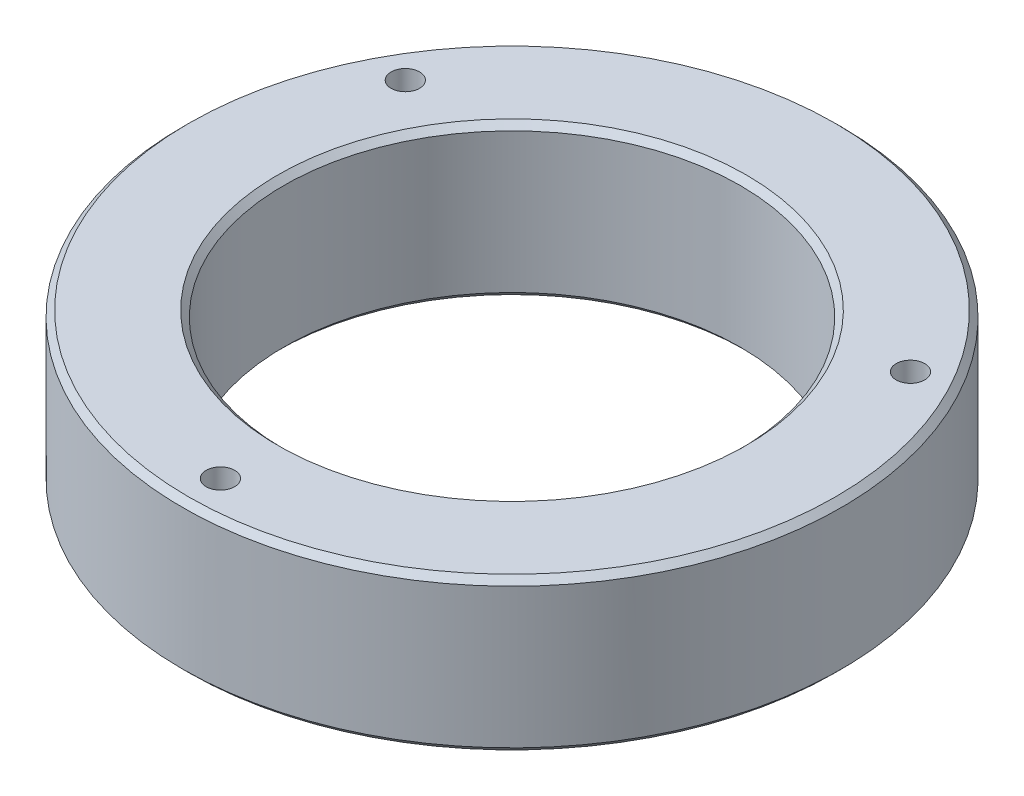
ISO-10303-21;
HEADER;
FILE_DESCRIPTION(('STEP AP214'),'2;1');
FILE_NAME('part.step','',(''),(''),'','','');
FILE_SCHEMA(('AUTOMOTIVE_DESIGN { 1 0 10303 214 1 1 1 1 }'));
ENDSEC;
DATA;
#1=APPLICATION_CONTEXT('core data for automotive mechanical design processes');
#2=APPLICATION_PROTOCOL_DEFINITION('international standard','automotive_design',2000,#1);
#3=PRODUCT_CONTEXT('',#1,'mechanical');
#4=PRODUCT('Part','Part','',(#3));
#5=PRODUCT_RELATED_PRODUCT_CATEGORY('part','',(#4));
#6=PRODUCT_DEFINITION_FORMATION('','',#4);
#7=PRODUCT_DEFINITION_CONTEXT('part definition',#1,'design');
#8=PRODUCT_DEFINITION('design','',#6,#7);
#9=PRODUCT_DEFINITION_SHAPE('','',#8);
#10=(LENGTH_UNIT() NAMED_UNIT(*) SI_UNIT(.MILLI.,.METRE.));
#11=(NAMED_UNIT(*) PLANE_ANGLE_UNIT() SI_UNIT($,.RADIAN.));
#12=(NAMED_UNIT(*) SI_UNIT($,.STERADIAN.) SOLID_ANGLE_UNIT());
#13=UNCERTAINTY_MEASURE_WITH_UNIT(LENGTH_MEASURE(1.E-05),#10,'distance_accuracy_value','');
#14=(GEOMETRIC_REPRESENTATION_CONTEXT(3) GLOBAL_UNCERTAINTY_ASSIGNED_CONTEXT((#13)) GLOBAL_UNIT_ASSIGNED_CONTEXT((#10,
#11,#12)) REPRESENTATION_CONTEXT('',''));
#15=CARTESIAN_POINT('',(0.,0.,0.));
#16=DIRECTION('',(0.,0.,1.));
#17=DIRECTION('',(1.,0.,0.));
#18=AXIS2_PLACEMENT_3D('',#15,#16,#17);
#19=CARTESIAN_POINT('',(-57.15,-19.05,0.));
#20=DIRECTION('',(0.,1.,0.));
#21=DIRECTION('',(0.,0.,1.));
#22=AXIS2_PLACEMENT_3D('',#19,#20,#21);
#23=PLANE('',#22);
#24=CARTESIAN_POINT('',(0.,-19.05,0.));
#25=DIRECTION('',(0.,1.,0.));
#26=DIRECTION('',(0.,0.,1.));
#27=AXIS2_PLACEMENT_3D('',#24,#25,#26);
#28=CIRCLE('',#27,58.674);
#29=CARTESIAN_POINT('',(0.,-19.05,-58.674));
#30=VERTEX_POINT('',#29);
#31=EDGE_CURVE('E134',#30,#30,#28,.T.);
#32=ORIENTED_EDGE('',*,*,#31,.T.);
#33=EDGE_LOOP('',(#32));
#34=FACE_BOUND('',#33,.T.);
#35=CARTESIAN_POINT('',(0.,-19.05,0.));
#36=DIRECTION('',(0.,1.,0.));
#37=DIRECTION('',(0.,0.,1.));
#38=AXIS2_PLACEMENT_3D('',#35,#36,#37);
#39=CIRCLE('',#38,81.0006);
#40=CARTESIAN_POINT('',(0.,-19.05,81.0006));
#41=VERTEX_POINT('',#40);
#42=EDGE_CURVE('E131',#41,#41,#39,.F.);
#43=ORIENTED_EDGE('',*,*,#42,.T.);
#44=EDGE_LOOP('',(#43));
#45=FACE_BOUND('',#44,.T.);
#46=CARTESIAN_POINT('',(69.85,-19.05,0.));
#47=DIRECTION('',(0.,-1.,0.));
#48=DIRECTION('',(0.,0.,-1.));
#49=AXIS2_PLACEMENT_3D('',#46,#47,#48);
#50=CIRCLE('',#49,3.96874999999999);
#51=CARTESIAN_POINT('',(69.85,-19.05,-3.96874999999999));
#52=VERTEX_POINT('',#51);
#53=EDGE_CURVE('E73',#52,#52,#50,.T.);
#54=ORIENTED_EDGE('',*,*,#53,.F.);
#55=EDGE_LOOP('',(#54));
#56=FACE_BOUND('',#55,.T.);
#57=CARTESIAN_POINT('',(-69.85,-19.05,0.));
#58=DIRECTION('',(0.,-1.,0.));
#59=DIRECTION('',(0.,0.,-1.));
#60=AXIS2_PLACEMENT_3D('',#57,#58,#59);
#61=CIRCLE('',#60,3.96874999999999);
#62=CARTESIAN_POINT('',(-69.85,-19.05,-3.96874999999999));
#63=VERTEX_POINT('',#62);
#64=EDGE_CURVE('E72',#63,#63,#61,.T.);
#65=ORIENTED_EDGE('',*,*,#64,.F.);
#66=EDGE_LOOP('',(#65));
#67=FACE_BOUND('',#66,.T.);
#68=CARTESIAN_POINT('',(0.,-19.05,73.025));
#69=DIRECTION('',(0.,1.,0.));
#70=DIRECTION('',(0.,0.,1.));
#71=AXIS2_PLACEMENT_3D('',#68,#69,#70);
#72=CIRCLE('',#71,5.5626);
#73=CARTESIAN_POINT('',(0.,-19.05,78.5876));
#74=VERTEX_POINT('',#73);
#75=EDGE_CURVE('E88',#74,#74,#72,.T.);
#76=ORIENTED_EDGE('',*,*,#75,.T.);
#77=EDGE_LOOP('',(#76));
#78=FACE_BOUND('',#77,.T.);
#79=CARTESIAN_POINT('',(63.246,-19.05,-36.5252));
#80=DIRECTION('',(0.,1.,0.));
#81=DIRECTION('',(0.,0.,1.));
#82=AXIS2_PLACEMENT_3D('',#79,#80,#81);
#83=CIRCLE('',#82,5.5626);
#84=CARTESIAN_POINT('',(63.246,-19.05,-30.9626));
#85=VERTEX_POINT('',#84);
#86=EDGE_CURVE('E91',#85,#85,#83,.T.);
#87=ORIENTED_EDGE('',*,*,#86,.T.);
#88=EDGE_LOOP('',(#87));
#89=FACE_BOUND('',#88,.T.);
#90=CARTESIAN_POINT('',(-63.246,-19.05,-36.5252));
#91=DIRECTION('',(0.,1.,0.));
#92=DIRECTION('',(0.,0.,1.));
#93=AXIS2_PLACEMENT_3D('',#90,#91,#92);
#94=CIRCLE('',#93,5.5626);
#95=CARTESIAN_POINT('',(-63.246,-19.05,-30.9626));
#96=VERTEX_POINT('',#95);
#97=EDGE_CURVE('E97',#96,#96,#94,.T.);
#98=ORIENTED_EDGE('',*,*,#97,.T.);
#99=EDGE_LOOP('',(#98));
#100=FACE_BOUND('',#99,.T.);
#101=ADVANCED_FACE('F47',(#34,#45,#56,#67,#78,#89,#100),#23,.F.);
#102=CARTESIAN_POINT('',(0.,-44.45,0.));
#103=DIRECTION('',(0.,-1.,0.));
#104=DIRECTION('',(0.,0.,-1.));
#105=AXIS2_PLACEMENT_3D('',#102,#103,#104);
#106=CYLINDRICAL_SURFACE('',#105,82.5246);
#107=CARTESIAN_POINT('',(0.,17.526,0.));
#108=DIRECTION('',(0.,-1.,0.));
#109=DIRECTION('',(0.,0.,-1.));
#110=AXIS2_PLACEMENT_3D('',#107,#108,#109);
#111=CIRCLE('',#110,82.5246);
#112=CARTESIAN_POINT('',(0.,17.526,-82.5246));
#113=VERTEX_POINT('',#112);
#114=EDGE_CURVE('E11',#113,#113,#111,.T.);
#115=ORIENTED_EDGE('',*,*,#114,.T.);
#116=EDGE_LOOP('',(#115));
#117=FACE_BOUND('',#116,.T.);
#118=CARTESIAN_POINT('',(0.,-17.526,0.));
#119=DIRECTION('',(0.,1.,0.));
#120=DIRECTION('',(0.,0.,1.));
#121=AXIS2_PLACEMENT_3D('',#118,#119,#120);
#122=CIRCLE('',#121,82.5246);
#123=CARTESIAN_POINT('',(0.,-17.526,82.5246));
#124=VERTEX_POINT('',#123);
#125=EDGE_CURVE('E56',#124,#124,#122,.T.);
#126=ORIENTED_EDGE('',*,*,#125,.T.);
#127=EDGE_LOOP('',(#126));
#128=FACE_BOUND('',#127,.T.);
#129=ADVANCED_FACE('F139',(#117,#128),#106,.T.);
#130=CARTESIAN_POINT('',(-82.5246,19.05,0.));
#131=DIRECTION('',(0.,-1.,0.));
#132=DIRECTION('',(0.,0.,-1.));
#133=AXIS2_PLACEMENT_3D('',#130,#131,#132);
#134=PLANE('',#133);
#135=CARTESIAN_POINT('',(0.,19.05,0.));
#136=DIRECTION('',(0.,-1.,0.));
#137=DIRECTION('',(0.,0.,-1.));
#138=AXIS2_PLACEMENT_3D('',#135,#136,#137);
#139=CIRCLE('',#138,58.674);
#140=CARTESIAN_POINT('',(0.,19.05,-58.674));
#141=VERTEX_POINT('',#140);
#142=EDGE_CURVE('E122',#141,#141,#139,.T.);
#143=ORIENTED_EDGE('',*,*,#142,.T.);
#144=EDGE_LOOP('',(#143));
#145=FACE_BOUND('',#144,.T.);
#146=CARTESIAN_POINT('',(0.,19.05,0.));
#147=DIRECTION('',(0.,-1.,0.));
#148=DIRECTION('',(0.,0.,-1.));
#149=AXIS2_PLACEMENT_3D('',#146,#147,#148);
#150=CIRCLE('',#149,81.0006);
#151=CARTESIAN_POINT('',(0.,19.05,-81.0006));
#152=VERTEX_POINT('',#151);
#153=EDGE_CURVE('E105',#152,#152,#150,.F.);
#154=ORIENTED_EDGE('',*,*,#153,.T.);
#155=EDGE_LOOP('',(#154));
#156=FACE_BOUND('',#155,.T.);
#157=CARTESIAN_POINT('',(0.,19.05,73.025));
#158=DIRECTION('',(0.,1.,0.));
#159=DIRECTION('',(0.,0.,1.));
#160=AXIS2_PLACEMENT_3D('',#157,#158,#159);
#161=CIRCLE('',#160,3.5687);
#162=CARTESIAN_POINT('',(0.,19.05,69.4563));
#163=VERTEX_POINT('',#162);
#164=EDGE_CURVE('E102',#163,#163,#161,.T.);
#165=ORIENTED_EDGE('',*,*,#164,.F.);
#166=EDGE_LOOP('',(#165));
#167=FACE_BOUND('',#166,.T.);
#168=CARTESIAN_POINT('',(63.246,19.05,-36.5252));
#169=DIRECTION('',(0.,1.,0.));
#170=DIRECTION('',(0.,0.,1.));
#171=AXIS2_PLACEMENT_3D('',#168,#169,#170);
#172=CIRCLE('',#171,3.5687);
#173=CARTESIAN_POINT('',(63.246,19.05,-40.0939));
#174=VERTEX_POINT('',#173);
#175=EDGE_CURVE('E106',#174,#174,#172,.T.);
#176=ORIENTED_EDGE('',*,*,#175,.F.);
#177=EDGE_LOOP('',(#176));
#178=FACE_BOUND('',#177,.T.);
#179=CARTESIAN_POINT('',(-63.246,19.05,-36.5252));
#180=DIRECTION('',(0.,1.,0.));
#181=DIRECTION('',(0.,0.,1.));
#182=AXIS2_PLACEMENT_3D('',#179,#180,#181);
#183=CIRCLE('',#182,3.56869999999999);
#184=CARTESIAN_POINT('',(-63.246,19.05,-40.0939));
#185=VERTEX_POINT('',#184);
#186=EDGE_CURVE('E109',#185,#185,#183,.T.);
#187=ORIENTED_EDGE('',*,*,#186,.F.);
#188=EDGE_LOOP('',(#187));
#189=FACE_BOUND('',#188,.T.);
#190=ADVANCED_FACE('F194',(#145,#156,#167,#178,#189),#134,.F.);
#191=CARTESIAN_POINT('',(0.,-44.45,0.));
#192=DIRECTION('',(0.,-1.,0.));
#193=DIRECTION('',(0.,0.,-1.));
#194=AXIS2_PLACEMENT_3D('',#191,#192,#193);
#195=CYLINDRICAL_SURFACE('',#194,57.15);
#196=CARTESIAN_POINT('',(0.,17.526,0.));
#197=DIRECTION('',(0.,-1.,0.));
#198=DIRECTION('',(0.,0.,-1.));
#199=AXIS2_PLACEMENT_3D('',#196,#197,#198);
#200=CIRCLE('',#199,57.15);
#201=CARTESIAN_POINT('',(0.,17.526,-57.15));
#202=VERTEX_POINT('',#201);
#203=EDGE_CURVE('E128',#202,#202,#200,.F.);
#204=CARTESIAN_POINT('',(0.,-17.526,0.));
#205=DIRECTION('',(0.,1.,0.));
#206=DIRECTION('',(0.,0.,1.));
#207=AXIS2_PLACEMENT_3D('',#204,#205,#206);
#208=CIRCLE('',#207,57.15);
#209=CARTESIAN_POINT('',(0.,-17.526,-57.15));
#210=VERTEX_POINT('',#209);
#211=EDGE_CURVE('E125',#210,#210,#208,.F.);
#212=CARTESIAN_POINT('',(0.,17.526,-57.15));
#213=CARTESIAN_POINT('',(0.,17.160875,-57.15));
#214=CARTESIAN_POINT('',(0.,16.79575,-57.15));
#215=CARTESIAN_POINT('',(0.,16.0655,-57.15));
#216=CARTESIAN_POINT('',(0.,15.700375,-57.15));
#217=CARTESIAN_POINT('',(0.,14.970125,-57.15));
#218=CARTESIAN_POINT('',(0.,14.605,-57.15));
#219=CARTESIAN_POINT('',(0.,13.87475,-57.15));
#220=CARTESIAN_POINT('',(0.,13.509625,-57.15));
#221=CARTESIAN_POINT('',(0.,12.779375,-57.15));
#222=CARTESIAN_POINT('',(0.,12.41425,-57.15));
#223=CARTESIAN_POINT('',(0.,11.684,-57.15));
#224=CARTESIAN_POINT('',(0.,11.318875,-57.15));
#225=CARTESIAN_POINT('',(0.,10.588625,-57.15));
#226=CARTESIAN_POINT('',(0.,10.2235,-57.15));
#227=CARTESIAN_POINT('',(0.,9.49324999999998,-57.15));
#228=CARTESIAN_POINT('',(0.,9.12812499999998,-57.15));
#229=CARTESIAN_POINT('',(0.,8.39787499999998,-57.15));
#230=CARTESIAN_POINT('',(0.,8.03274999999998,-57.15));
#231=CARTESIAN_POINT('',(0.,7.30249999999998,-57.15));
#232=CARTESIAN_POINT('',(0.,6.93737499999998,-57.15));
#233=CARTESIAN_POINT('',(0.,6.20712499999998,-57.15));
#234=CARTESIAN_POINT('',(0.,5.84199999999998,-57.15));
#235=CARTESIAN_POINT('',(0.,5.11174999999998,-57.15));
#236=CARTESIAN_POINT('',(0.,4.74662499999998,-57.15));
#237=CARTESIAN_POINT('',(0.,4.01637499999998,-57.15));
#238=CARTESIAN_POINT('',(0.,3.65124999999998,-57.15));
#239=CARTESIAN_POINT('',(0.,2.92099999999998,-57.15));
#240=CARTESIAN_POINT('',(0.,2.55587499999998,-57.15));
#241=CARTESIAN_POINT('',(0.,1.82562499999998,-57.15));
#242=CARTESIAN_POINT('',(0.,1.46049999999998,-57.15));
#243=CARTESIAN_POINT('',(0.,0.730249999999976,-57.15));
#244=CARTESIAN_POINT('',(0.,0.365124999999978,-57.15));
#245=CARTESIAN_POINT('',(0.,-0.365125000000019,-57.15));
#246=CARTESIAN_POINT('',(0.,-0.730250000000018,-57.15));
#247=CARTESIAN_POINT('',(0.,-1.46050000000002,-57.15));
#248=CARTESIAN_POINT('',(0.,-1.82562500000002,-57.15));
#249=CARTESIAN_POINT('',(0.,-2.55587500000002,-57.15));
#250=CARTESIAN_POINT('',(0.,-2.92100000000002,-57.15));
#251=CARTESIAN_POINT('',(0.,-3.65125000000002,-57.15));
#252=CARTESIAN_POINT('',(0.,-4.01637500000002,-57.15));
#253=CARTESIAN_POINT('',(0.,-4.74662500000002,-57.15));
#254=CARTESIAN_POINT('',(0.,-5.11175000000002,-57.15));
#255=CARTESIAN_POINT('',(0.,-5.84200000000002,-57.15));
#256=CARTESIAN_POINT('',(0.,-6.20712500000002,-57.15));
#257=CARTESIAN_POINT('',(0.,-6.93737500000002,-57.15));
#258=CARTESIAN_POINT('',(0.,-7.30250000000002,-57.15));
#259=CARTESIAN_POINT('',(0.,-8.03275000000002,-57.15));
#260=CARTESIAN_POINT('',(0.,-8.39787500000002,-57.15));
#261=CARTESIAN_POINT('',(0.,-9.12812500000002,-57.15));
#262=CARTESIAN_POINT('',(0.,-9.49325000000002,-57.15));
#263=CARTESIAN_POINT('',(0.,-10.2235,-57.15));
#264=CARTESIAN_POINT('',(0.,-10.588625,-57.15));
#265=CARTESIAN_POINT('',(0.,-11.318875,-57.15));
#266=CARTESIAN_POINT('',(0.,-11.684,-57.15));
#267=CARTESIAN_POINT('',(0.,-12.41425,-57.15));
#268=CARTESIAN_POINT('',(0.,-12.779375,-57.15));
#269=CARTESIAN_POINT('',(0.,-13.509625,-57.15));
#270=CARTESIAN_POINT('',(0.,-13.87475,-57.15));
#271=CARTESIAN_POINT('',(0.,-14.605,-57.15));
#272=CARTESIAN_POINT('',(0.,-14.970125,-57.15));
#273=CARTESIAN_POINT('',(0.,-15.700375,-57.15));
#274=CARTESIAN_POINT('',(0.,-16.0655,-57.15));
#275=CARTESIAN_POINT('',(0.,-16.79575,-57.15));
#276=CARTESIAN_POINT('',(0.,-17.160875,-57.15));
#277=CARTESIAN_POINT('',(0.,-17.526,-57.15));
#278=B_SPLINE_CURVE_WITH_KNOTS('',3,(#212,#213,#214,#215,#216,#217,#218,#219,#220,#221,#222,
#223,#224,#225,#226,#227,#228,#229,#230,#231,#232,#233,#234,#235,#236,#237,#238,#239,#240,#241,
#242,#243,#244,#245,#246,#247,#248,#249,#250,#251,#252,#253,#254,#255,#256,#257,#258,#259,#260,
#261,#262,#263,#264,#265,#266,#267,#268,#269,#270,#271,#272,#273,#274,#275,#276,#277),
.UNSPECIFIED.,.F.,.F.,(4,2,2,2,2,2,2,2,2,2,2,2,2,2,2,2,2,2,2,2,2,2,2,2,2,2,2,2,2,2,2,2,4),(0.,
1.095375,2.19075,3.286125,4.3815,5.476875,6.57225,7.667625,8.763,9.858375,10.95375,12.049125,
13.1445,14.239875,15.33525,16.430625,17.526,18.621375,19.71675,20.812125,21.9075,23.002875,
24.09825,25.193625,26.289,27.384375,28.47975,29.575125,30.6705,31.765875,32.86125,33.956625,
35.052),.UNSPECIFIED.);
#279=EDGE_CURVE('BSEAM190',#202,#210,#278,.T.);
#280=ORIENTED_EDGE('',*,*,#203,.T.);
#281=ORIENTED_EDGE('',*,*,#211,.T.);
#282=ORIENTED_EDGE('',*,*,#279,.T.);
#283=ORIENTED_EDGE('',*,*,#279,.F.);
#284=EDGE_LOOP('',(#280,#282,#281,#283));
#285=FACE_BOUND('',#284,.T.);
#286=ADVANCED_FACE('F190',(#285),#195,.F.);
#287=CARTESIAN_POINT('',(-63.246,19.05,-36.5252));
#288=DIRECTION('',(0.,-1.,0.));
#289=DIRECTION('',(0.,0.,-1.));
#290=AXIS2_PLACEMENT_3D('',#287,#288,#289);
#291=CYLINDRICAL_SURFACE('',#290,3.56869999999999);
#292=CARTESIAN_POINT('',(-63.246,-9.398,-36.5252));
#293=DIRECTION('',(0.,1.,0.));
#294=DIRECTION('',(0.,0.,1.));
#295=AXIS2_PLACEMENT_3D('',#292,#293,#294);
#296=CIRCLE('',#295,3.56869999999999);
#297=CARTESIAN_POINT('',(-63.246,-9.398,-40.0939));
#298=VERTEX_POINT('',#297);
#299=EDGE_CURVE('E112',#298,#298,#296,.T.);
#300=CARTESIAN_POINT('',(-63.246,-9.398,-40.0939));
#301=CARTESIAN_POINT('',(-63.246,-9.10166666666667,-40.0939));
#302=CARTESIAN_POINT('',(-63.246,-8.80533333333333,-40.0939));
#303=CARTESIAN_POINT('',(-63.246,-8.21266666666667,-40.0939));
#304=CARTESIAN_POINT('',(-63.246,-7.91633333333333,-40.0939));
#305=CARTESIAN_POINT('',(-63.246,-7.32366666666667,-40.0939));
#306=CARTESIAN_POINT('',(-63.246,-7.02733333333333,-40.0939));
#307=CARTESIAN_POINT('',(-63.246,-6.43466666666667,-40.0939));
#308=CARTESIAN_POINT('',(-63.246,-6.13833333333333,-40.0939));
#309=CARTESIAN_POINT('',(-63.246,-5.54566666666667,-40.0939));
#310=CARTESIAN_POINT('',(-63.246,-5.24933333333333,-40.0939));
#311=CARTESIAN_POINT('',(-63.246,-4.65666666666667,-40.0939));
#312=CARTESIAN_POINT('',(-63.246,-4.36033333333333,-40.0939));
#313=CARTESIAN_POINT('',(-63.246,-3.76766666666667,-40.0939));
#314=CARTESIAN_POINT('',(-63.246,-3.47133333333333,-40.0939));
#315=CARTESIAN_POINT('',(-63.246,-2.87866666666667,-40.0939));
#316=CARTESIAN_POINT('',(-63.246,-2.58233333333333,-40.0939));
#317=CARTESIAN_POINT('',(-63.246,-1.98966666666667,-40.0939));
#318=CARTESIAN_POINT('',(-63.246,-1.69333333333333,-40.0939));
#319=CARTESIAN_POINT('',(-63.246,-1.10066666666667,-40.0939));
#320=CARTESIAN_POINT('',(-63.246,-0.804333333333332,-40.0939));
#321=CARTESIAN_POINT('',(-63.246,-0.211666666666664,-40.0939));
#322=CARTESIAN_POINT('',(-63.246,0.0846666666666693,-40.0939));
#323=CARTESIAN_POINT('',(-63.246,0.677333333333336,-40.0939));
#324=CARTESIAN_POINT('',(-63.246,0.97366666666667,-40.0939));
#325=CARTESIAN_POINT('',(-63.246,1.56633333333334,-40.0939));
#326=CARTESIAN_POINT('',(-63.246,1.86266666666667,-40.0939));
#327=CARTESIAN_POINT('',(-63.246,2.45533333333334,-40.0939));
#328=CARTESIAN_POINT('',(-63.246,2.75166666666667,-40.0939));
#329=CARTESIAN_POINT('',(-63.246,3.34433333333333,-40.0939));
#330=CARTESIAN_POINT('',(-63.246,3.64066666666667,-40.0939));
#331=CARTESIAN_POINT('',(-63.246,4.23333333333333,-40.0939));
#332=CARTESIAN_POINT('',(-63.246,4.52966666666667,-40.0939));
#333=CARTESIAN_POINT('',(-63.246,5.12233333333333,-40.0939));
#334=CARTESIAN_POINT('',(-63.246,5.41866666666667,-40.0939));
#335=CARTESIAN_POINT('',(-63.246,6.01133333333333,-40.0939));
#336=CARTESIAN_POINT('',(-63.246,6.30766666666667,-40.0939));
#337=CARTESIAN_POINT('',(-63.246,6.90033333333333,-40.0939));
#338=CARTESIAN_POINT('',(-63.246,7.19666666666667,-40.0939));
#339=CARTESIAN_POINT('',(-63.246,7.78933333333333,-40.0939));
#340=CARTESIAN_POINT('',(-63.246,8.08566666666667,-40.0939));
#341=CARTESIAN_POINT('',(-63.246,8.67833333333333,-40.0939));
#342=CARTESIAN_POINT('',(-63.246,8.97466666666667,-40.0939));
#343=CARTESIAN_POINT('',(-63.246,9.56733333333333,-40.0939));
#344=CARTESIAN_POINT('',(-63.246,9.86366666666667,-40.0939));
#345=CARTESIAN_POINT('',(-63.246,10.4563333333333,-40.0939));
#346=CARTESIAN_POINT('',(-63.246,10.7526666666667,-40.0939));
#347=CARTESIAN_POINT('',(-63.246,11.3453333333333,-40.0939));
#348=CARTESIAN_POINT('',(-63.246,11.6416666666667,-40.0939));
#349=CARTESIAN_POINT('',(-63.246,12.2343333333333,-40.0939));
#350=CARTESIAN_POINT('',(-63.246,12.5306666666667,-40.0939));
#351=CARTESIAN_POINT('',(-63.246,13.1233333333333,-40.0939));
#352=CARTESIAN_POINT('',(-63.246,13.4196666666667,-40.0939));
#353=CARTESIAN_POINT('',(-63.246,14.0123333333333,-40.0939));
#354=CARTESIAN_POINT('',(-63.246,14.3086666666667,-40.0939));
#355=CARTESIAN_POINT('',(-63.246,14.9013333333333,-40.0939));
#356=CARTESIAN_POINT('',(-63.246,15.1976666666667,-40.0939));
#357=CARTESIAN_POINT('',(-63.246,15.7903333333333,-40.0939));
#358=CARTESIAN_POINT('',(-63.246,16.0866666666667,-40.0939));
#359=CARTESIAN_POINT('',(-63.246,16.6793333333333,-40.0939));
#360=CARTESIAN_POINT('',(-63.246,16.9756666666667,-40.0939));
#361=CARTESIAN_POINT('',(-63.246,17.5683333333333,-40.0939));
#362=CARTESIAN_POINT('',(-63.246,17.8646666666667,-40.0939));
#363=CARTESIAN_POINT('',(-63.246,18.4573333333333,-40.0939));
#364=CARTESIAN_POINT('',(-63.246,18.7536666666667,-40.0939));
#365=CARTESIAN_POINT('',(-63.246,19.05,-40.0939));
#366=B_SPLINE_CURVE_WITH_KNOTS('',3,(#300,#301,#302,#303,#304,#305,#306,#307,#308,#309,#310,
#311,#312,#313,#314,#315,#316,#317,#318,#319,#320,#321,#322,#323,#324,#325,#326,#327,#328,#329,
#330,#331,#332,#333,#334,#335,#336,#337,#338,#339,#340,#341,#342,#343,#344,#345,#346,#347,#348,
#349,#350,#351,#352,#353,#354,#355,#356,#357,#358,#359,#360,#361,#362,#363,#364,#365),
.UNSPECIFIED.,.F.,.F.,(4,2,2,2,2,2,2,2,2,2,2,2,2,2,2,2,2,2,2,2,2,2,2,2,2,2,2,2,2,2,2,2,4),(0.,
0.889000000000001,1.778,2.667,3.556,4.445,5.334,6.223,7.112,8.001,8.89,9.779,10.668,11.557,
12.446,13.335,14.224,15.113,16.002,16.891,17.78,18.669,19.558,20.447,21.336,22.225,23.114,
24.003,24.892,25.781,26.67,27.559,28.448),.UNSPECIFIED.);
#367=EDGE_CURVE('BSEAM186',#298,#185,#366,.T.);
#368=ORIENTED_EDGE('',*,*,#299,.F.);
#369=ORIENTED_EDGE('',*,*,#186,.T.);
#370=ORIENTED_EDGE('',*,*,#367,.T.);
#371=ORIENTED_EDGE('',*,*,#367,.F.);
#372=EDGE_LOOP('',(#368,#370,#369,#371));
#373=FACE_BOUND('',#372,.T.);
#374=ADVANCED_FACE('F186',(#373),#291,.F.);
#375=CARTESIAN_POINT('',(63.246,19.05,-36.5252));
#376=DIRECTION('',(0.,-1.,0.));
#377=DIRECTION('',(0.,0.,-1.));
#378=AXIS2_PLACEMENT_3D('',#375,#376,#377);
#379=CYLINDRICAL_SURFACE('',#378,3.5687);
#380=CARTESIAN_POINT('',(63.246,-9.398,-36.5252));
#381=DIRECTION('',(0.,1.,0.));
#382=DIRECTION('',(0.,0.,1.));
#383=AXIS2_PLACEMENT_3D('',#380,#381,#382);
#384=CIRCLE('',#383,3.5687);
#385=CARTESIAN_POINT('',(63.246,-9.398,-40.0939));
#386=VERTEX_POINT('',#385);
#387=EDGE_CURVE('E115',#386,#386,#384,.T.);
#388=CARTESIAN_POINT('',(63.246,-9.398,-40.0939));
#389=CARTESIAN_POINT('',(63.246,-9.10166666666667,-40.0939));
#390=CARTESIAN_POINT('',(63.246,-8.80533333333333,-40.0939));
#391=CARTESIAN_POINT('',(63.246,-8.21266666666667,-40.0939));
#392=CARTESIAN_POINT('',(63.246,-7.91633333333333,-40.0939));
#393=CARTESIAN_POINT('',(63.246,-7.32366666666667,-40.0939));
#394=CARTESIAN_POINT('',(63.246,-7.02733333333333,-40.0939));
#395=CARTESIAN_POINT('',(63.246,-6.43466666666667,-40.0939));
#396=CARTESIAN_POINT('',(63.246,-6.13833333333333,-40.0939));
#397=CARTESIAN_POINT('',(63.246,-5.54566666666667,-40.0939));
#398=CARTESIAN_POINT('',(63.246,-5.24933333333333,-40.0939));
#399=CARTESIAN_POINT('',(63.246,-4.65666666666667,-40.0939));
#400=CARTESIAN_POINT('',(63.246,-4.36033333333333,-40.0939));
#401=CARTESIAN_POINT('',(63.246,-3.76766666666667,-40.0939));
#402=CARTESIAN_POINT('',(63.246,-3.47133333333333,-40.0939));
#403=CARTESIAN_POINT('',(63.246,-2.87866666666667,-40.0939));
#404=CARTESIAN_POINT('',(63.246,-2.58233333333333,-40.0939));
#405=CARTESIAN_POINT('',(63.246,-1.98966666666667,-40.0939));
#406=CARTESIAN_POINT('',(63.246,-1.69333333333333,-40.0939));
#407=CARTESIAN_POINT('',(63.246,-1.10066666666667,-40.0939));
#408=CARTESIAN_POINT('',(63.246,-0.804333333333332,-40.0939));
#409=CARTESIAN_POINT('',(63.246,-0.211666666666664,-40.0939));
#410=CARTESIAN_POINT('',(63.246,0.0846666666666693,-40.0939));
#411=CARTESIAN_POINT('',(63.246,0.677333333333336,-40.0939));
#412=CARTESIAN_POINT('',(63.246,0.97366666666667,-40.0939));
#413=CARTESIAN_POINT('',(63.246,1.56633333333334,-40.0939));
#414=CARTESIAN_POINT('',(63.246,1.86266666666667,-40.0939));
#415=CARTESIAN_POINT('',(63.246,2.45533333333334,-40.0939));
#416=CARTESIAN_POINT('',(63.246,2.75166666666667,-40.0939));
#417=CARTESIAN_POINT('',(63.246,3.34433333333333,-40.0939));
#418=CARTESIAN_POINT('',(63.246,3.64066666666667,-40.0939));
#419=CARTESIAN_POINT('',(63.246,4.23333333333333,-40.0939));
#420=CARTESIAN_POINT('',(63.246,4.52966666666667,-40.0939));
#421=CARTESIAN_POINT('',(63.246,5.12233333333333,-40.0939));
#422=CARTESIAN_POINT('',(63.246,5.41866666666667,-40.0939));
#423=CARTESIAN_POINT('',(63.246,6.01133333333333,-40.0939));
#424=CARTESIAN_POINT('',(63.246,6.30766666666667,-40.0939));
#425=CARTESIAN_POINT('',(63.246,6.90033333333333,-40.0939));
#426=CARTESIAN_POINT('',(63.246,7.19666666666667,-40.0939));
#427=CARTESIAN_POINT('',(63.246,7.78933333333333,-40.0939));
#428=CARTESIAN_POINT('',(63.246,8.08566666666667,-40.0939));
#429=CARTESIAN_POINT('',(63.246,8.67833333333333,-40.0939));
#430=CARTESIAN_POINT('',(63.246,8.97466666666667,-40.0939));
#431=CARTESIAN_POINT('',(63.246,9.56733333333333,-40.0939));
#432=CARTESIAN_POINT('',(63.246,9.86366666666667,-40.0939));
#433=CARTESIAN_POINT('',(63.246,10.4563333333333,-40.0939));
#434=CARTESIAN_POINT('',(63.246,10.7526666666667,-40.0939));
#435=CARTESIAN_POINT('',(63.246,11.3453333333333,-40.0939));
#436=CARTESIAN_POINT('',(63.246,11.6416666666667,-40.0939));
#437=CARTESIAN_POINT('',(63.246,12.2343333333333,-40.0939));
#438=CARTESIAN_POINT('',(63.246,12.5306666666667,-40.0939));
#439=CARTESIAN_POINT('',(63.246,13.1233333333333,-40.0939));
#440=CARTESIAN_POINT('',(63.246,13.4196666666667,-40.0939));
#441=CARTESIAN_POINT('',(63.246,14.0123333333333,-40.0939));
#442=CARTESIAN_POINT('',(63.246,14.3086666666667,-40.0939));
#443=CARTESIAN_POINT('',(63.246,14.9013333333333,-40.0939));
#444=CARTESIAN_POINT('',(63.246,15.1976666666667,-40.0939));
#445=CARTESIAN_POINT('',(63.246,15.7903333333333,-40.0939));
#446=CARTESIAN_POINT('',(63.246,16.0866666666667,-40.0939));
#447=CARTESIAN_POINT('',(63.246,16.6793333333333,-40.0939));
#448=CARTESIAN_POINT('',(63.246,16.9756666666667,-40.0939));
#449=CARTESIAN_POINT('',(63.246,17.5683333333333,-40.0939));
#450=CARTESIAN_POINT('',(63.246,17.8646666666667,-40.0939));
#451=CARTESIAN_POINT('',(63.246,18.4573333333333,-40.0939));
#452=CARTESIAN_POINT('',(63.246,18.7536666666667,-40.0939));
#453=CARTESIAN_POINT('',(63.246,19.05,-40.0939));
#454=B_SPLINE_CURVE_WITH_KNOTS('',3,(#388,#389,#390,#391,#392,#393,#394,#395,#396,#397,#398,
#399,#400,#401,#402,#403,#404,#405,#406,#407,#408,#409,#410,#411,#412,#413,#414,#415,#416,#417,
#418,#419,#420,#421,#422,#423,#424,#425,#426,#427,#428,#429,#430,#431,#432,#433,#434,#435,#436,
#437,#438,#439,#440,#441,#442,#443,#444,#445,#446,#447,#448,#449,#450,#451,#452,#453),
.UNSPECIFIED.,.F.,.F.,(4,2,2,2,2,2,2,2,2,2,2,2,2,2,2,2,2,2,2,2,2,2,2,2,2,2,2,2,2,2,2,2,4),(0.,
0.889000000000001,1.778,2.667,3.556,4.445,5.334,6.223,7.112,8.001,8.89,9.779,10.668,11.557,
12.446,13.335,14.224,15.113,16.002,16.891,17.78,18.669,19.558,20.447,21.336,22.225,23.114,
24.003,24.892,25.781,26.67,27.559,28.448),.UNSPECIFIED.);
#455=EDGE_CURVE('BSEAM182',#386,#174,#454,.T.);
#456=ORIENTED_EDGE('',*,*,#387,.F.);
#457=ORIENTED_EDGE('',*,*,#175,.T.);
#458=ORIENTED_EDGE('',*,*,#455,.T.);
#459=ORIENTED_EDGE('',*,*,#455,.F.);
#460=EDGE_LOOP('',(#456,#458,#457,#459));
#461=FACE_BOUND('',#460,.T.);
#462=ADVANCED_FACE('F182',(#461),#379,.F.);
#463=CARTESIAN_POINT('',(0.,19.05,73.025));
#464=DIRECTION('',(0.,-1.,0.));
#465=DIRECTION('',(0.,0.,-1.));
#466=AXIS2_PLACEMENT_3D('',#463,#464,#465);
#467=CYLINDRICAL_SURFACE('',#466,3.5687);
#468=CARTESIAN_POINT('',(0.,-9.398,73.025));
#469=DIRECTION('',(0.,1.,0.));
#470=DIRECTION('',(0.,0.,1.));
#471=AXIS2_PLACEMENT_3D('',#468,#469,#470);
#472=CIRCLE('',#471,3.5687);
#473=CARTESIAN_POINT('',(0.,-9.398,69.4563));
#474=VERTEX_POINT('',#473);
#475=EDGE_CURVE('E87',#474,#474,#472,.T.);
#476=CARTESIAN_POINT('',(0.,-9.398,69.4563));
#477=CARTESIAN_POINT('',(0.,-9.10166666666667,69.4563));
#478=CARTESIAN_POINT('',(0.,-8.80533333333333,69.4563));
#479=CARTESIAN_POINT('',(0.,-8.21266666666667,69.4563));
#480=CARTESIAN_POINT('',(0.,-7.91633333333333,69.4563));
#481=CARTESIAN_POINT('',(0.,-7.32366666666667,69.4563));
#482=CARTESIAN_POINT('',(0.,-7.02733333333333,69.4563));
#483=CARTESIAN_POINT('',(0.,-6.43466666666667,69.4563));
#484=CARTESIAN_POINT('',(0.,-6.13833333333333,69.4563));
#485=CARTESIAN_POINT('',(0.,-5.54566666666667,69.4563));
#486=CARTESIAN_POINT('',(0.,-5.24933333333333,69.4563));
#487=CARTESIAN_POINT('',(0.,-4.65666666666667,69.4563));
#488=CARTESIAN_POINT('',(0.,-4.36033333333333,69.4563));
#489=CARTESIAN_POINT('',(0.,-3.76766666666667,69.4563));
#490=CARTESIAN_POINT('',(0.,-3.47133333333333,69.4563));
#491=CARTESIAN_POINT('',(0.,-2.87866666666667,69.4563));
#492=CARTESIAN_POINT('',(0.,-2.58233333333333,69.4563));
#493=CARTESIAN_POINT('',(0.,-1.98966666666667,69.4563));
#494=CARTESIAN_POINT('',(0.,-1.69333333333333,69.4563));
#495=CARTESIAN_POINT('',(0.,-1.10066666666667,69.4563));
#496=CARTESIAN_POINT('',(0.,-0.804333333333332,69.4563));
#497=CARTESIAN_POINT('',(0.,-0.211666666666664,69.4563));
#498=CARTESIAN_POINT('',(0.,0.0846666666666693,69.4563));
#499=CARTESIAN_POINT('',(0.,0.677333333333336,69.4563));
#500=CARTESIAN_POINT('',(0.,0.97366666666667,69.4563));
#501=CARTESIAN_POINT('',(0.,1.56633333333334,69.4563));
#502=CARTESIAN_POINT('',(0.,1.86266666666667,69.4563));
#503=CARTESIAN_POINT('',(0.,2.45533333333334,69.4563));
#504=CARTESIAN_POINT('',(0.,2.75166666666667,69.4563));
#505=CARTESIAN_POINT('',(0.,3.34433333333333,69.4563));
#506=CARTESIAN_POINT('',(0.,3.64066666666667,69.4563));
#507=CARTESIAN_POINT('',(0.,4.23333333333333,69.4563));
#508=CARTESIAN_POINT('',(0.,4.52966666666667,69.4563));
#509=CARTESIAN_POINT('',(0.,5.12233333333333,69.4563));
#510=CARTESIAN_POINT('',(0.,5.41866666666667,69.4563));
#511=CARTESIAN_POINT('',(0.,6.01133333333333,69.4563));
#512=CARTESIAN_POINT('',(0.,6.30766666666667,69.4563));
#513=CARTESIAN_POINT('',(0.,6.90033333333333,69.4563));
#514=CARTESIAN_POINT('',(0.,7.19666666666667,69.4563));
#515=CARTESIAN_POINT('',(0.,7.78933333333333,69.4563));
#516=CARTESIAN_POINT('',(0.,8.08566666666667,69.4563));
#517=CARTESIAN_POINT('',(0.,8.67833333333333,69.4563));
#518=CARTESIAN_POINT('',(0.,8.97466666666667,69.4563));
#519=CARTESIAN_POINT('',(0.,9.56733333333333,69.4563));
#520=CARTESIAN_POINT('',(0.,9.86366666666667,69.4563));
#521=CARTESIAN_POINT('',(0.,10.4563333333333,69.4563));
#522=CARTESIAN_POINT('',(0.,10.7526666666667,69.4563));
#523=CARTESIAN_POINT('',(0.,11.3453333333333,69.4563));
#524=CARTESIAN_POINT('',(0.,11.6416666666667,69.4563));
#525=CARTESIAN_POINT('',(0.,12.2343333333333,69.4563));
#526=CARTESIAN_POINT('',(0.,12.5306666666667,69.4563));
#527=CARTESIAN_POINT('',(0.,13.1233333333333,69.4563));
#528=CARTESIAN_POINT('',(0.,13.4196666666667,69.4563));
#529=CARTESIAN_POINT('',(0.,14.0123333333333,69.4563));
#530=CARTESIAN_POINT('',(0.,14.3086666666667,69.4563));
#531=CARTESIAN_POINT('',(0.,14.9013333333333,69.4563));
#532=CARTESIAN_POINT('',(0.,15.1976666666667,69.4563));
#533=CARTESIAN_POINT('',(0.,15.7903333333333,69.4563));
#534=CARTESIAN_POINT('',(0.,16.0866666666667,69.4563));
#535=CARTESIAN_POINT('',(0.,16.6793333333333,69.4563));
#536=CARTESIAN_POINT('',(0.,16.9756666666667,69.4563));
#537=CARTESIAN_POINT('',(0.,17.5683333333333,69.4563));
#538=CARTESIAN_POINT('',(0.,17.8646666666667,69.4563));
#539=CARTESIAN_POINT('',(0.,18.4573333333333,69.4563));
#540=CARTESIAN_POINT('',(0.,18.7536666666667,69.4563));
#541=CARTESIAN_POINT('',(0.,19.05,69.4563));
#542=B_SPLINE_CURVE_WITH_KNOTS('',3,(#476,#477,#478,#479,#480,#481,#482,#483,#484,#485,#486,
#487,#488,#489,#490,#491,#492,#493,#494,#495,#496,#497,#498,#499,#500,#501,#502,#503,#504,#505,
#506,#507,#508,#509,#510,#511,#512,#513,#514,#515,#516,#517,#518,#519,#520,#521,#522,#523,#524,
#525,#526,#527,#528,#529,#530,#531,#532,#533,#534,#535,#536,#537,#538,#539,#540,#541),
.UNSPECIFIED.,.F.,.F.,(4,2,2,2,2,2,2,2,2,2,2,2,2,2,2,2,2,2,2,2,2,2,2,2,2,2,2,2,2,2,2,2,4),(0.,
0.889000000000001,1.778,2.667,3.556,4.445,5.334,6.223,7.112,8.001,8.89,9.779,10.668,11.557,
12.446,13.335,14.224,15.113,16.002,16.891,17.78,18.669,19.558,20.447,21.336,22.225,23.114,
24.003,24.892,25.781,26.67,27.559,28.448),.UNSPECIFIED.);
#543=EDGE_CURVE('BSEAM178',#474,#163,#542,.T.);
#544=ORIENTED_EDGE('',*,*,#475,.F.);
#545=ORIENTED_EDGE('',*,*,#164,.T.);
#546=ORIENTED_EDGE('',*,*,#543,.T.);
#547=ORIENTED_EDGE('',*,*,#543,.F.);
#548=EDGE_LOOP('',(#544,#546,#545,#547));
#549=FACE_BOUND('',#548,.T.);
#550=ADVANCED_FACE('F178',(#549),#467,.F.);
#551=CARTESIAN_POINT('',(0.,-9.398,73.025));
#552=DIRECTION('',(0.,-1.,0.));
#553=DIRECTION('',(0.,0.,-1.));
#554=AXIS2_PLACEMENT_3D('',#551,#552,#553);
#555=CYLINDRICAL_SURFACE('',#554,5.5626);
#556=CARTESIAN_POINT('',(0.,-9.398,73.025));
#557=DIRECTION('',(0.,1.,0.));
#558=DIRECTION('',(0.,0.,1.));
#559=AXIS2_PLACEMENT_3D('',#556,#557,#558);
#560=CIRCLE('',#559,5.5626);
#561=CARTESIAN_POINT('',(0.,-9.398,78.5876));
#562=VERTEX_POINT('',#561);
#563=EDGE_CURVE('E84',#562,#562,#560,.T.);
#564=ORIENTED_EDGE('',*,*,#563,.T.);
#565=EDGE_LOOP('',(#564));
#566=FACE_BOUND('',#565,.T.);
#567=ORIENTED_EDGE('',*,*,#75,.F.);
#568=EDGE_LOOP('',(#567));
#569=FACE_BOUND('',#568,.T.);
#570=ADVANCED_FACE('F181',(#566,#569),#555,.F.);
#571=CARTESIAN_POINT('',(0.,-9.398,73.025));
#572=DIRECTION('',(0.,1.,0.));
#573=DIRECTION('',(0.,0.,1.));
#574=AXIS2_PLACEMENT_3D('',#571,#572,#573);
#575=PLANE('',#574);
#576=ORIENTED_EDGE('',*,*,#475,.T.);
#577=EDGE_LOOP('',(#576));
#578=FACE_BOUND('',#577,.T.);
#579=ORIENTED_EDGE('',*,*,#563,.F.);
#580=EDGE_LOOP('',(#579));
#581=FACE_BOUND('',#580,.T.);
#582=ADVANCED_FACE('F304',(#578,#581),#575,.F.);
#583=CARTESIAN_POINT('',(63.246,-9.398,-36.5252));
#584=DIRECTION('',(0.,-1.,0.));
#585=DIRECTION('',(0.,0.,-1.));
#586=AXIS2_PLACEMENT_3D('',#583,#584,#585);
#587=CYLINDRICAL_SURFACE('',#586,5.5626);
#588=CARTESIAN_POINT('',(63.246,-9.398,-36.5252));
#589=DIRECTION('',(0.,1.,0.));
#590=DIRECTION('',(0.,0.,1.));
#591=AXIS2_PLACEMENT_3D('',#588,#589,#590);
#592=CIRCLE('',#591,5.5626);
#593=CARTESIAN_POINT('',(63.246,-9.398,-30.9626));
#594=VERTEX_POINT('',#593);
#595=EDGE_CURVE('E94',#594,#594,#592,.T.);
#596=ORIENTED_EDGE('',*,*,#595,.T.);
#597=EDGE_LOOP('',(#596));
#598=FACE_BOUND('',#597,.T.);
#599=ORIENTED_EDGE('',*,*,#86,.F.);
#600=EDGE_LOOP('',(#599));
#601=FACE_BOUND('',#600,.T.);
#602=ADVANCED_FACE('F173',(#598,#601),#587,.F.);
#603=CARTESIAN_POINT('',(63.246,-9.398,-36.5252));
#604=DIRECTION('',(0.,1.,0.));
#605=DIRECTION('',(0.,0.,1.));
#606=AXIS2_PLACEMENT_3D('',#603,#604,#605);
#607=PLANE('',#606);
#608=ORIENTED_EDGE('',*,*,#387,.T.);
#609=EDGE_LOOP('',(#608));
#610=FACE_BOUND('',#609,.T.);
#611=ORIENTED_EDGE('',*,*,#595,.F.);
#612=EDGE_LOOP('',(#611));
#613=FACE_BOUND('',#612,.T.);
#614=ADVANCED_FACE('F163',(#610,#613),#607,.F.);
#615=CARTESIAN_POINT('',(-63.246,-9.398,-36.5252));
#616=DIRECTION('',(0.,-1.,0.));
#617=DIRECTION('',(0.,0.,-1.));
#618=AXIS2_PLACEMENT_3D('',#615,#616,#617);
#619=CYLINDRICAL_SURFACE('',#618,5.5626);
#620=CARTESIAN_POINT('',(-63.246,-9.398,-36.5252));
#621=DIRECTION('',(0.,1.,0.));
#622=DIRECTION('',(0.,0.,1.));
#623=AXIS2_PLACEMENT_3D('',#620,#621,#622);
#624=CIRCLE('',#623,5.5626);
#625=CARTESIAN_POINT('',(-63.246,-9.398,-30.9626));
#626=VERTEX_POINT('',#625);
#627=EDGE_CURVE('E83',#626,#626,#624,.T.);
#628=ORIENTED_EDGE('',*,*,#627,.T.);
#629=EDGE_LOOP('',(#628));
#630=FACE_BOUND('',#629,.T.);
#631=ORIENTED_EDGE('',*,*,#97,.F.);
#632=EDGE_LOOP('',(#631));
#633=FACE_BOUND('',#632,.T.);
#634=ADVANCED_FACE('F160',(#630,#633),#619,.F.);
#635=CARTESIAN_POINT('',(-63.246,-9.398,-36.5252));
#636=DIRECTION('',(0.,1.,0.));
#637=DIRECTION('',(0.,0.,1.));
#638=AXIS2_PLACEMENT_3D('',#635,#636,#637);
#639=PLANE('',#638);
#640=ORIENTED_EDGE('',*,*,#299,.T.);
#641=EDGE_LOOP('',(#640));
#642=FACE_BOUND('',#641,.T.);
#643=ORIENTED_EDGE('',*,*,#627,.F.);
#644=EDGE_LOOP('',(#643));
#645=FACE_BOUND('',#644,.T.);
#646=ADVANCED_FACE('F162',(#642,#645),#639,.F.);
#647=CARTESIAN_POINT('',(-69.85,6.35000000000001,0.));
#648=DIRECTION('',(0.,-1.,0.));
#649=DIRECTION('',(0.,0.,-1.));
#650=AXIS2_PLACEMENT_3D('',#647,#648,#649);
#651=CONICAL_SURFACE('',#650,3.96874999999999,1.02974425867665);
#652=CARTESIAN_POINT('',(-69.85,8.73466558176564,0.));
#653=VERTEX_POINT('',#652);
#654=VERTEX_LOOP('',#653);
#655=FACE_BOUND('',#654,.T.);
#656=CARTESIAN_POINT('',(-69.85,6.35000000000001,0.));
#657=DIRECTION('',(0.,-1.,0.));
#658=DIRECTION('',(0.,0.,-1.));
#659=AXIS2_PLACEMENT_3D('',#656,#657,#658);
#660=CIRCLE('',#659,3.96874999999999);
#661=CARTESIAN_POINT('',(-69.85,6.35000000000001,-3.96874999999999));
#662=VERTEX_POINT('',#661);
#663=EDGE_CURVE('E76',#662,#662,#660,.T.);
#664=ORIENTED_EDGE('',*,*,#663,.T.);
#665=EDGE_LOOP('',(#664));
#666=FACE_BOUND('',#665,.T.);
#667=ADVANCED_FACE('F170',(#655,#666),#651,.F.);
#668=CARTESIAN_POINT('',(-69.85,-19.05,0.));
#669=DIRECTION('',(0.,-1.,0.));
#670=DIRECTION('',(0.,0.,-1.));
#671=AXIS2_PLACEMENT_3D('',#668,#669,#670);
#672=CYLINDRICAL_SURFACE('',#671,3.96874999999999);
#673=ORIENTED_EDGE('',*,*,#663,.F.);
#674=EDGE_LOOP('',(#673));
#675=FACE_BOUND('',#674,.T.);
#676=ORIENTED_EDGE('',*,*,#64,.T.);
#677=EDGE_LOOP('',(#676));
#678=FACE_BOUND('',#677,.T.);
#679=ADVANCED_FACE('F66',(#675,#678),#672,.F.);
#680=CARTESIAN_POINT('',(69.85,6.35000000000001,0.));
#681=DIRECTION('',(0.,-1.,0.));
#682=DIRECTION('',(0.,0.,-1.));
#683=AXIS2_PLACEMENT_3D('',#680,#681,#682);
#684=CONICAL_SURFACE('',#683,3.96874999999999,1.02974425867665);
#685=CARTESIAN_POINT('',(69.85,8.73466558176564,0.));
#686=VERTEX_POINT('',#685);
#687=VERTEX_LOOP('',#686);
#688=FACE_BOUND('',#687,.T.);
#689=CARTESIAN_POINT('',(69.85,6.35000000000001,0.));
#690=DIRECTION('',(0.,-1.,0.));
#691=DIRECTION('',(0.,0.,-1.));
#692=AXIS2_PLACEMENT_3D('',#689,#690,#691);
#693=CIRCLE('',#692,3.96874999999999);
#694=CARTESIAN_POINT('',(69.85,6.35000000000001,-3.96874999999999));
#695=VERTEX_POINT('',#694);
#696=EDGE_CURVE('E70',#695,#695,#693,.T.);
#697=ORIENTED_EDGE('',*,*,#696,.T.);
#698=EDGE_LOOP('',(#697));
#699=FACE_BOUND('',#698,.T.);
#700=ADVANCED_FACE('F62',(#688,#699),#684,.F.);
#701=CARTESIAN_POINT('',(69.85,-19.05,0.));
#702=DIRECTION('',(0.,-1.,0.));
#703=DIRECTION('',(0.,0.,-1.));
#704=AXIS2_PLACEMENT_3D('',#701,#702,#703);
#705=CYLINDRICAL_SURFACE('',#704,3.96874999999999);
#706=ORIENTED_EDGE('',*,*,#696,.F.);
#707=EDGE_LOOP('',(#706));
#708=FACE_BOUND('',#707,.T.);
#709=ORIENTED_EDGE('',*,*,#53,.T.);
#710=EDGE_LOOP('',(#709));
#711=FACE_BOUND('',#710,.T.);
#712=ADVANCED_FACE('F65',(#708,#711),#705,.F.);
#713=CARTESIAN_POINT('',(0.,19.05,0.));
#714=DIRECTION('',(0.,1.,0.));
#715=DIRECTION('',(0.,0.,1.));
#716=AXIS2_PLACEMENT_3D('',#713,#714,#715);
#717=CONICAL_SURFACE('',#716,58.674,0.785398163397435);
#718=ORIENTED_EDGE('',*,*,#203,.F.);
#719=EDGE_LOOP('',(#718));
#720=FACE_BOUND('',#719,.T.);
#721=ORIENTED_EDGE('',*,*,#142,.F.);
#722=EDGE_LOOP('',(#721));
#723=FACE_BOUND('',#722,.T.);
#724=ADVANCED_FACE('F203',(#720,#723),#717,.F.);
#725=CARTESIAN_POINT('',(0.,-17.526,0.));
#726=DIRECTION('',(0.,-1.,0.));
#727=DIRECTION('',(0.,0.,-1.));
#728=AXIS2_PLACEMENT_3D('',#725,#726,#727);
#729=CONICAL_SURFACE('',#728,57.15,0.785398163397451);
#730=CARTESIAN_POINT('',(0.,-19.05,-58.674));
#731=CARTESIAN_POINT('',(0.,-19.034125,-58.658125));
#732=CARTESIAN_POINT('',(0.,-19.01825,-58.64225));
#733=CARTESIAN_POINT('',(0.,-18.9865,-58.6105));
#734=CARTESIAN_POINT('',(0.,-18.970625,-58.594625));
#735=CARTESIAN_POINT('',(0.,-18.938875,-58.562875));
#736=CARTESIAN_POINT('',(0.,-18.923,-58.547));
#737=CARTESIAN_POINT('',(0.,-18.89125,-58.51525));
#738=CARTESIAN_POINT('',(0.,-18.875375,-58.499375));
#739=CARTESIAN_POINT('',(0.,-18.843625,-58.467625));
#740=CARTESIAN_POINT('',(0.,-18.82775,-58.45175));
#741=CARTESIAN_POINT('',(0.,-18.796,-58.42));
#742=CARTESIAN_POINT('',(0.,-18.780125,-58.404125));
#743=CARTESIAN_POINT('',(0.,-18.748375,-58.372375));
#744=CARTESIAN_POINT('',(0.,-18.7325,-58.3565));
#745=CARTESIAN_POINT('',(0.,-18.70075,-58.32475));
#746=CARTESIAN_POINT('',(0.,-18.684875,-58.308875));
#747=CARTESIAN_POINT('',(0.,-18.653125,-58.277125));
#748=CARTESIAN_POINT('',(0.,-18.63725,-58.26125));
#749=CARTESIAN_POINT('',(0.,-18.6055,-58.2295));
#750=CARTESIAN_POINT('',(0.,-18.589625,-58.213625));
#751=CARTESIAN_POINT('',(0.,-18.557875,-58.181875));
#752=CARTESIAN_POINT('',(0.,-18.542,-58.166));
#753=CARTESIAN_POINT('',(0.,-18.51025,-58.13425));
#754=CARTESIAN_POINT('',(0.,-18.494375,-58.118375));
#755=CARTESIAN_POINT('',(0.,-18.462625,-58.086625));
#756=CARTESIAN_POINT('',(0.,-18.44675,-58.07075));
#757=CARTESIAN_POINT('',(0.,-18.415,-58.039));
#758=CARTESIAN_POINT('',(0.,-18.399125,-58.023125));
#759=CARTESIAN_POINT('',(0.,-18.367375,-57.991375));
#760=CARTESIAN_POINT('',(0.,-18.3515,-57.9755));
#761=CARTESIAN_POINT('',(0.,-18.31975,-57.94375));
#762=CARTESIAN_POINT('',(0.,-18.303875,-57.927875));
#763=CARTESIAN_POINT('',(0.,-18.272125,-57.896125));
#764=CARTESIAN_POINT('',(0.,-18.25625,-57.88025));
#765=CARTESIAN_POINT('',(0.,-18.2245,-57.8485));
#766=CARTESIAN_POINT('',(0.,-18.208625,-57.832625));
#767=CARTESIAN_POINT('',(0.,-18.176875,-57.800875));
#768=CARTESIAN_POINT('',(0.,-18.161,-57.785));
#769=CARTESIAN_POINT('',(0.,-18.12925,-57.75325));
#770=CARTESIAN_POINT('',(0.,-18.113375,-57.737375));
#771=CARTESIAN_POINT('',(0.,-18.081625,-57.705625));
#772=CARTESIAN_POINT('',(0.,-18.06575,-57.68975));
#773=CARTESIAN_POINT('',(0.,-18.034,-57.658));
#774=CARTESIAN_POINT('',(0.,-18.018125,-57.642125));
#775=CARTESIAN_POINT('',(0.,-17.986375,-57.610375));
#776=CARTESIAN_POINT('',(0.,-17.9705,-57.5945));
#777=CARTESIAN_POINT('',(0.,-17.93875,-57.56275));
#778=CARTESIAN_POINT('',(0.,-17.922875,-57.546875));
#779=CARTESIAN_POINT('',(0.,-17.891125,-57.515125));
#780=CARTESIAN_POINT('',(0.,-17.87525,-57.49925));
#781=CARTESIAN_POINT('',(0.,-17.8435,-57.4675));
#782=CARTESIAN_POINT('',(0.,-17.827625,-57.451625));
#783=CARTESIAN_POINT('',(0.,-17.795875,-57.419875));
#784=CARTESIAN_POINT('',(0.,-17.78,-57.404));
#785=CARTESIAN_POINT('',(0.,-17.74825,-57.37225));
#786=CARTESIAN_POINT('',(0.,-17.732375,-57.356375));
#787=CARTESIAN_POINT('',(0.,-17.700625,-57.324625));
#788=CARTESIAN_POINT('',(0.,-17.68475,-57.30875));
#789=CARTESIAN_POINT('',(0.,-17.653,-57.277));
#790=CARTESIAN_POINT('',(0.,-17.637125,-57.261125));
#791=CARTESIAN_POINT('',(0.,-17.605375,-57.229375));
#792=CARTESIAN_POINT('',(0.,-17.5895,-57.2135));
#793=CARTESIAN_POINT('',(0.,-17.55775,-57.18175));
#794=CARTESIAN_POINT('',(0.,-17.541875,-57.165875));
#795=CARTESIAN_POINT('',(0.,-17.526,-57.15));
#796=B_SPLINE_CURVE_WITH_KNOTS('',3,(#730,#731,#732,#733,#734,#735,#736,#737,#738,#739,#740,
#741,#742,#743,#744,#745,#746,#747,#748,#749,#750,#751,#752,#753,#754,#755,#756,#757,#758,#759,
#760,#761,#762,#763,#764,#765,#766,#767,#768,#769,#770,#771,#772,#773,#774,#775,#776,#777,#778,
#779,#780,#781,#782,#783,#784,#785,#786,#787,#788,#789,#790,#791,#792,#793,#794,#795),
.UNSPECIFIED.,.F.,.F.,(4,2,2,2,2,2,2,2,2,2,2,2,2,2,2,2,2,2,2,2,2,2,2,2,2,2,2,2,2,2,2,2,4),(0.,
0.0673519209080149,0.134703841816037,0.202055762724052,0.269407683632072,0.336759604540087,
0.404111525448106,0.471463446356126,0.538815367264141,0.606167288172161,0.673519209080176,
0.740871129988195,0.80822305089621,0.87557497180423,0.94292689271225,1.01027881362026,
1.07763073452828,1.1449826554363,1.21233457634432,1.27968649725234,1.34703841816036,
1.41439033906838,1.48174225997639,1.54909418088441,1.61644610179242,1.68379802270044,
1.75114994360846,1.81850186451648,1.88585378542449,1.95320570633251,2.02055762724053,
2.08790954814855,2.15526146905657),.UNSPECIFIED.);
#797=EDGE_CURVE('BSEAM209',#30,#210,#796,.T.);
#798=ORIENTED_EDGE('',*,*,#31,.F.);
#799=ORIENTED_EDGE('',*,*,#211,.F.);
#800=ORIENTED_EDGE('',*,*,#797,.T.);
#801=ORIENTED_EDGE('',*,*,#797,.F.);
#802=EDGE_LOOP('',(#798,#800,#799,#801));
#803=FACE_BOUND('',#802,.T.);
#804=ADVANCED_FACE('F209',(#803),#729,.F.);
#805=CARTESIAN_POINT('',(0.,17.526,0.));
#806=DIRECTION('',(0.,-1.,0.));
#807=DIRECTION('',(0.,0.,-1.));
#808=AXIS2_PLACEMENT_3D('',#805,#806,#807);
#809=CONICAL_SURFACE('',#808,82.5246,0.785398163397451);
#810=ORIENTED_EDGE('',*,*,#153,.F.);
#811=EDGE_LOOP('',(#810));
#812=FACE_BOUND('',#811,.T.);
#813=ORIENTED_EDGE('',*,*,#114,.F.);
#814=EDGE_LOOP('',(#813));
#815=FACE_BOUND('',#814,.T.);
#816=ADVANCED_FACE('F143',(#812,#815),#809,.T.);
#817=CARTESIAN_POINT('',(0.,-19.05,0.));
#818=DIRECTION('',(0.,1.,0.));
#819=DIRECTION('',(0.,0.,1.));
#820=AXIS2_PLACEMENT_3D('',#817,#818,#819);
#821=CONICAL_SURFACE('',#820,81.0006,0.785398163397448);
#822=ORIENTED_EDGE('',*,*,#125,.F.);
#823=EDGE_LOOP('',(#822));
#824=FACE_BOUND('',#823,.T.);
#825=ORIENTED_EDGE('',*,*,#42,.F.);
#826=EDGE_LOOP('',(#825));
#827=FACE_BOUND('',#826,.T.);
#828=ADVANCED_FACE('F50',(#824,#827),#821,.T.);
#829=CLOSED_SHELL('',(#101,#129,#190,#286,#374,#462,#550,#570,#582,#602,#614,#634,#646,#667,
#679,#700,#712,#724,#804,#816,#828));
#830=MANIFOLD_SOLID_BREP('B2',#829);
#831=ADVANCED_BREP_SHAPE_REPRESENTATION('',(#18,#830),#14);
#832=SHAPE_DEFINITION_REPRESENTATION(#9,#831);
ENDSEC;
END-ISO-10303-21;
